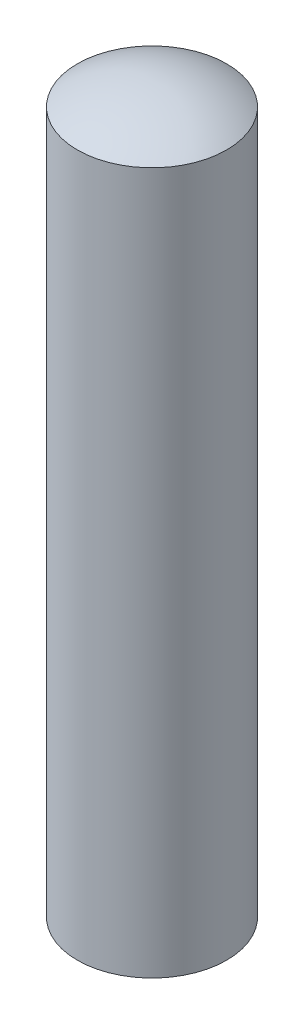
ISO-10303-21;
HEADER;
FILE_DESCRIPTION(('STEP AP214'),'2;1');
FILE_NAME('part.step','',(''),(''),'','','');
FILE_SCHEMA(('AUTOMOTIVE_DESIGN { 1 0 10303 214 1 1 1 1 }'));
ENDSEC;
DATA;
#1=APPLICATION_CONTEXT('core data for automotive mechanical design processes');
#2=APPLICATION_PROTOCOL_DEFINITION('international standard','automotive_design',2000,#1);
#3=PRODUCT_CONTEXT('',#1,'mechanical');
#4=PRODUCT('Part','Part','',(#3));
#5=PRODUCT_RELATED_PRODUCT_CATEGORY('part','',(#4));
#6=PRODUCT_DEFINITION_FORMATION('','',#4);
#7=PRODUCT_DEFINITION_CONTEXT('part definition',#1,'design');
#8=PRODUCT_DEFINITION('design','',#6,#7);
#9=PRODUCT_DEFINITION_SHAPE('','',#8);
#10=(LENGTH_UNIT() NAMED_UNIT(*) SI_UNIT(.MILLI.,.METRE.));
#11=(NAMED_UNIT(*) PLANE_ANGLE_UNIT() SI_UNIT($,.RADIAN.));
#12=(NAMED_UNIT(*) SI_UNIT($,.STERADIAN.) SOLID_ANGLE_UNIT());
#13=UNCERTAINTY_MEASURE_WITH_UNIT(LENGTH_MEASURE(1.E-05),#10,'distance_accuracy_value','');
#14=(GEOMETRIC_REPRESENTATION_CONTEXT(3) GLOBAL_UNCERTAINTY_ASSIGNED_CONTEXT((#13)) GLOBAL_UNIT_ASSIGNED_CONTEXT((#10,
#11,#12)) REPRESENTATION_CONTEXT('',''));
#15=CARTESIAN_POINT('',(0.,0.,0.));
#16=DIRECTION('',(0.,0.,1.));
#17=DIRECTION('',(1.,0.,0.));
#18=AXIS2_PLACEMENT_3D('',#15,#16,#17);
#19=CARTESIAN_POINT('',(0.,-7.26666666666667,0.));
#20=DIRECTION('',(0.,1.,0.));
#21=DIRECTION('',(1.,0.,0.));
#22=AXIS2_PLACEMENT_3D('',#19,#20,#21);
#23=SPHERICAL_SURFACE('',#22,7.26666666666667);
#24=CARTESIAN_POINT('',(0.,-1.2,0.));
#25=DIRECTION('',(0.,1.,0.));
#26=DIRECTION('',(-1.,0.,0.));
#27=AXIS2_PLACEMENT_3D('',#24,#25,#26);
#28=CIRCLE('',#27,4.);
#29=CARTESIAN_POINT('',(-4.,-1.2,0.));
#30=VERTEX_POINT('',#29);
#31=EDGE_CURVE('E10',#30,#30,#28,.T.);
#32=ORIENTED_EDGE('',*,*,#31,.T.);
#33=EDGE_LOOP('',(#32));
#34=FACE_BOUND('',#33,.T.);
#35=ADVANCED_FACE('F39',(#34),#23,.T.);
#36=CARTESIAN_POINT('',(0.,5.,0.));
#37=DIRECTION('',(0.,1.,0.));
#38=DIRECTION('',(-1.,0.,0.));
#39=AXIS2_PLACEMENT_3D('',#36,#37,#38);
#40=CYLINDRICAL_SURFACE('',#39,4.);
#41=ORIENTED_EDGE('',*,*,#31,.F.);
#42=EDGE_LOOP('',(#41));
#43=FACE_BOUND('',#42,.T.);
#44=CARTESIAN_POINT('',(0.,-38.8,0.));
#45=DIRECTION('',(0.,1.,0.));
#46=DIRECTION('',(-1.,0.,0.));
#47=AXIS2_PLACEMENT_3D('',#44,#45,#46);
#48=CIRCLE('',#47,4.);
#49=CARTESIAN_POINT('',(-3.99999999999999,-38.8,0.));
#50=VERTEX_POINT('',#49);
#51=EDGE_CURVE('E45',#50,#50,#48,.T.);
#52=ORIENTED_EDGE('',*,*,#51,.T.);
#53=EDGE_LOOP('',(#52));
#54=FACE_BOUND('',#53,.T.);
#55=ADVANCED_FACE('F51',(#43,#54),#40,.T.);
#56=CARTESIAN_POINT('',(0.,-32.7333333333333,0.));
#57=DIRECTION('',(0.,1.,0.));
#58=DIRECTION('',(1.,0.,0.));
#59=AXIS2_PLACEMENT_3D('',#56,#57,#58);
#60=SPHERICAL_SURFACE('',#59,7.26666666666665);
#61=ORIENTED_EDGE('',*,*,#51,.F.);
#62=EDGE_LOOP('',(#61));
#63=FACE_BOUND('',#62,.T.);
#64=ADVANCED_FACE('F53',(#63),#60,.T.);
#65=CLOSED_SHELL('',(#35,#55,#64));
#66=MANIFOLD_SOLID_BREP('B2',#65);
#67=ADVANCED_BREP_SHAPE_REPRESENTATION('',(#18,#66),#14);
#68=SHAPE_DEFINITION_REPRESENTATION(#9,#67);
ENDSEC;
END-ISO-10303-21;
